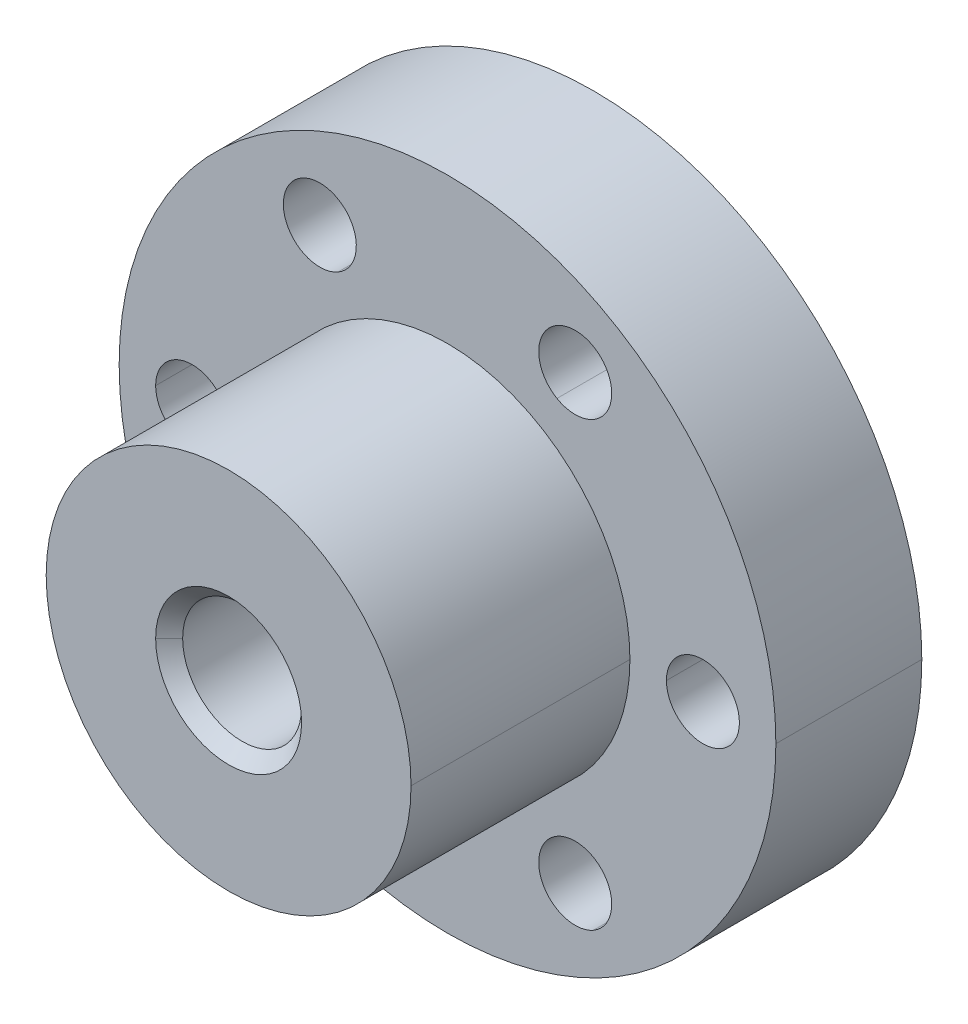
ISO-10303-21;
HEADER;
FILE_DESCRIPTION(('STEP AP214'),'2;1');
FILE_NAME('part.step','',(''),(''),'','','');
FILE_SCHEMA(('AUTOMOTIVE_DESIGN { 1 0 10303 214 1 1 1 1 }'));
ENDSEC;
DATA;
#1=APPLICATION_CONTEXT('core data for automotive mechanical design processes');
#2=APPLICATION_PROTOCOL_DEFINITION('international standard','automotive_design',2000,#1);
#3=PRODUCT_CONTEXT('',#1,'mechanical');
#4=PRODUCT('Part','Part','',(#3));
#5=PRODUCT_RELATED_PRODUCT_CATEGORY('part','',(#4));
#6=PRODUCT_DEFINITION_FORMATION('','',#4);
#7=PRODUCT_DEFINITION_CONTEXT('part definition',#1,'design');
#8=PRODUCT_DEFINITION('design','',#6,#7);
#9=PRODUCT_DEFINITION_SHAPE('','',#8);
#10=(LENGTH_UNIT() NAMED_UNIT(*) SI_UNIT(.MILLI.,.METRE.));
#11=(NAMED_UNIT(*) PLANE_ANGLE_UNIT() SI_UNIT($,.RADIAN.));
#12=(NAMED_UNIT(*) SI_UNIT($,.STERADIAN.) SOLID_ANGLE_UNIT());
#13=UNCERTAINTY_MEASURE_WITH_UNIT(LENGTH_MEASURE(1.E-05),#10,'distance_accuracy_value','');
#14=(GEOMETRIC_REPRESENTATION_CONTEXT(3) GLOBAL_UNCERTAINTY_ASSIGNED_CONTEXT((#13)) GLOBAL_UNIT_ASSIGNED_CONTEXT((#10,
#11,#12)) REPRESENTATION_CONTEXT('',''));
#15=CARTESIAN_POINT('',(0.,0.,0.));
#16=DIRECTION('',(0.,0.,1.));
#17=DIRECTION('',(1.,0.,0.));
#18=AXIS2_PLACEMENT_3D('',#15,#16,#17);
#19=CARTESIAN_POINT('',(0.,0.,0.375));
#20=DIRECTION('',(0.,0.,-1.));
#21=DIRECTION('',(1.,0.,0.));
#22=AXIS2_PLACEMENT_3D('',#19,#20,#21);
#23=CONICAL_SURFACE('',#22,3.625,0.785398163397448);
#24=DIRECTION('',(0.707106781186548,0.,0.707106781186548));
#25=VECTOR('',#24,1.);
#26=CARTESIAN_POINT('',(-3.625,0.,0.375));
#27=LINE('',#26,#25);
#28=CARTESIAN_POINT('',(-4.,0.,0.));
#29=VERTEX_POINT('',#28);
#30=CARTESIAN_POINT('',(-3.26,0.,0.740000000000001));
#31=VERTEX_POINT('',#30);
#32=EDGE_CURVE('E183',#29,#31,#27,.T.);
#33=ORIENTED_EDGE('',*,*,#32,.T.);
#34=CARTESIAN_POINT('',(0.,0.,0.740000000000001));
#35=DIRECTION('',(0.,0.,-1.));
#36=DIRECTION('',(-1.,0.,0.));
#37=AXIS2_PLACEMENT_3D('',#34,#35,#36);
#38=CIRCLE('',#37,3.26);
#39=CARTESIAN_POINT('',(3.26,0.,0.740000000000001));
#40=VERTEX_POINT('',#39);
#41=EDGE_CURVE('E63',#31,#40,#38,.F.);
#42=ORIENTED_EDGE('',*,*,#41,.T.);
#43=DIRECTION('',(0.707106781186548,0.,-0.707106781186548));
#44=VECTOR('',#43,1.);
#45=CARTESIAN_POINT('',(3.625,0.,0.375));
#46=LINE('',#45,#44);
#47=CARTESIAN_POINT('',(4.,0.,0.));
#48=VERTEX_POINT('',#47);
#49=EDGE_CURVE('E181',#40,#48,#46,.T.);
#50=ORIENTED_EDGE('',*,*,#49,.T.);
#51=CARTESIAN_POINT('',(0.,0.,0.));
#52=DIRECTION('',(0.,0.,-1.));
#53=DIRECTION('',(1.,0.,0.));
#54=AXIS2_PLACEMENT_3D('',#51,#52,#53);
#55=CIRCLE('',#54,4.);
#56=EDGE_CURVE('E50',#48,#29,#55,.T.);
#57=ORIENTED_EDGE('',*,*,#56,.T.);
#58=EDGE_LOOP('',(#33,#42,#50,#57));
#59=FACE_BOUND('',#58,.T.);
#60=ADVANCED_FACE('F42',(#59),#23,.F.);
#61=CARTESIAN_POINT('',(11.,0.,0.));
#62=DIRECTION('',(0.,0.,-1.));
#63=DIRECTION('',(0.,-1.,0.));
#64=AXIS2_PLACEMENT_3D('',#61,#62,#63);
#65=PLANE('',#64);
#66=ORIENTED_EDGE('',*,*,#56,.F.);
#67=CARTESIAN_POINT('',(0.,0.,0.));
#68=DIRECTION('',(0.,0.,-1.));
#69=DIRECTION('',(1.,0.,0.));
#70=AXIS2_PLACEMENT_3D('',#67,#68,#69);
#71=CIRCLE('',#70,4.);
#72=EDGE_CURVE('E189',#29,#48,#71,.T.);
#73=ORIENTED_EDGE('',*,*,#72,.F.);
#74=EDGE_LOOP('',(#66,#73));
#75=FACE_BOUND('',#74,.T.);
#76=CARTESIAN_POINT('',(14.,0.,0.));
#77=DIRECTION('',(0.,0.,1.));
#78=DIRECTION('',(1.,0.,0.));
#79=AXIS2_PLACEMENT_3D('',#76,#77,#78);
#80=CIRCLE('',#79,2.);
#81=CARTESIAN_POINT('',(16.,0.,0.));
#82=VERTEX_POINT('',#81);
#83=CARTESIAN_POINT('',(12.,0.,0.));
#84=VERTEX_POINT('',#83);
#85=EDGE_CURVE('E231',#82,#84,#80,.T.);
#86=ORIENTED_EDGE('',*,*,#85,.T.);
#87=CARTESIAN_POINT('',(14.,0.,0.));
#88=DIRECTION('',(0.,0.,1.));
#89=DIRECTION('',(1.,0.,0.));
#90=AXIS2_PLACEMENT_3D('',#87,#88,#89);
#91=CIRCLE('',#90,2.);
#92=EDGE_CURVE('E203',#84,#82,#91,.T.);
#93=ORIENTED_EDGE('',*,*,#92,.T.);
#94=EDGE_LOOP('',(#86,#93));
#95=FACE_BOUND('',#94,.T.);
#96=CARTESIAN_POINT('',(7.,12.1243556529821,0.));
#97=DIRECTION('',(0.,0.,1.));
#98=DIRECTION('',(0.5,0.866025403784439,0.));
#99=AXIS2_PLACEMENT_3D('',#96,#97,#98);
#100=CIRCLE('',#99,2.);
#101=CARTESIAN_POINT('',(8.,13.856406460551,0.));
#102=VERTEX_POINT('',#101);
#103=CARTESIAN_POINT('',(6.,10.3923048454133,0.));
#104=VERTEX_POINT('',#103);
#105=EDGE_CURVE('E237',#102,#104,#100,.T.);
#106=ORIENTED_EDGE('',*,*,#105,.T.);
#107=CARTESIAN_POINT('',(7.,12.1243556529821,0.));
#108=DIRECTION('',(0.,0.,1.));
#109=DIRECTION('',(0.5,0.866025403784439,0.));
#110=AXIS2_PLACEMENT_3D('',#107,#108,#109);
#111=CIRCLE('',#110,2.);
#112=EDGE_CURVE('E215',#104,#102,#111,.T.);
#113=ORIENTED_EDGE('',*,*,#112,.T.);
#114=EDGE_LOOP('',(#106,#113));
#115=FACE_BOUND('',#114,.T.);
#116=CARTESIAN_POINT('',(-7.,12.1243556529821,0.));
#117=DIRECTION('',(0.,0.,1.));
#118=DIRECTION('',(-0.5,0.866025403784439,0.));
#119=AXIS2_PLACEMENT_3D('',#116,#117,#118);
#120=CIRCLE('',#119,2.);
#121=CARTESIAN_POINT('',(-8.,13.856406460551,0.));
#122=VERTEX_POINT('',#121);
#123=CARTESIAN_POINT('',(-6.,10.3923048454133,0.));
#124=VERTEX_POINT('',#123);
#125=EDGE_CURVE('E292',#122,#124,#120,.T.);
#126=ORIENTED_EDGE('',*,*,#125,.T.);
#127=CARTESIAN_POINT('',(-7.,12.1243556529821,0.));
#128=DIRECTION('',(0.,0.,1.));
#129=DIRECTION('',(-0.5,0.866025403784439,0.));
#130=AXIS2_PLACEMENT_3D('',#127,#128,#129);
#131=CIRCLE('',#130,2.);
#132=EDGE_CURVE('E363',#124,#122,#131,.T.);
#133=ORIENTED_EDGE('',*,*,#132,.T.);
#134=EDGE_LOOP('',(#126,#133));
#135=FACE_BOUND('',#134,.T.);
#136=CARTESIAN_POINT('',(-14.,0.,0.));
#137=DIRECTION('',(0.,0.,1.));
#138=DIRECTION('',(-1.,0.,0.));
#139=AXIS2_PLACEMENT_3D('',#136,#137,#138);
#140=CIRCLE('',#139,2.);
#141=CARTESIAN_POINT('',(-16.,0.,0.));
#142=VERTEX_POINT('',#141);
#143=CARTESIAN_POINT('',(-12.,0.,0.));
#144=VERTEX_POINT('',#143);
#145=EDGE_CURVE('E285',#142,#144,#140,.T.);
#146=ORIENTED_EDGE('',*,*,#145,.T.);
#147=CARTESIAN_POINT('',(-14.,0.,0.));
#148=DIRECTION('',(0.,0.,1.));
#149=DIRECTION('',(-1.,0.,0.));
#150=AXIS2_PLACEMENT_3D('',#147,#148,#149);
#151=CIRCLE('',#150,2.);
#152=EDGE_CURVE('E225',#144,#142,#151,.T.);
#153=ORIENTED_EDGE('',*,*,#152,.T.);
#154=EDGE_LOOP('',(#146,#153));
#155=FACE_BOUND('',#154,.T.);
#156=CARTESIAN_POINT('',(-7.,-12.1243556529821,0.));
#157=DIRECTION('',(0.,0.,1.));
#158=DIRECTION('',(-0.5,-0.866025403784439,0.));
#159=AXIS2_PLACEMENT_3D('',#156,#157,#158);
#160=CIRCLE('',#159,2.);
#161=CARTESIAN_POINT('',(-8.,-13.856406460551,0.));
#162=VERTEX_POINT('',#161);
#163=CARTESIAN_POINT('',(-6.,-10.3923048454133,0.));
#164=VERTEX_POINT('',#163);
#165=EDGE_CURVE('E286',#162,#164,#160,.T.);
#166=ORIENTED_EDGE('',*,*,#165,.T.);
#167=CARTESIAN_POINT('',(-7.,-12.1243556529821,0.));
#168=DIRECTION('',(0.,0.,1.));
#169=DIRECTION('',(-0.5,-0.866025403784439,0.));
#170=AXIS2_PLACEMENT_3D('',#167,#168,#169);
#171=CIRCLE('',#170,2.);
#172=EDGE_CURVE('E252',#164,#162,#171,.T.);
#173=ORIENTED_EDGE('',*,*,#172,.T.);
#174=EDGE_LOOP('',(#166,#173));
#175=FACE_BOUND('',#174,.T.);
#176=CARTESIAN_POINT('',(7.,-12.1243556529821,0.));
#177=DIRECTION('',(0.,0.,1.));
#178=DIRECTION('',(0.5,-0.866025403784439,0.));
#179=AXIS2_PLACEMENT_3D('',#176,#177,#178);
#180=CIRCLE('',#179,2.);
#181=CARTESIAN_POINT('',(8.,-13.856406460551,0.));
#182=VERTEX_POINT('',#181);
#183=CARTESIAN_POINT('',(6.,-10.3923048454133,0.));
#184=VERTEX_POINT('',#183);
#185=EDGE_CURVE('E232',#182,#184,#180,.T.);
#186=ORIENTED_EDGE('',*,*,#185,.T.);
#187=CARTESIAN_POINT('',(7.,-12.1243556529821,0.));
#188=DIRECTION('',(0.,0.,1.));
#189=DIRECTION('',(0.5,-0.866025403784439,0.));
#190=AXIS2_PLACEMENT_3D('',#187,#188,#189);
#191=CIRCLE('',#190,2.);
#192=EDGE_CURVE('E301',#184,#182,#191,.T.);
#193=ORIENTED_EDGE('',*,*,#192,.T.);
#194=EDGE_LOOP('',(#186,#193));
#195=FACE_BOUND('',#194,.T.);
#196=CARTESIAN_POINT('',(0.,0.,0.));
#197=DIRECTION('',(0.,0.,-1.));
#198=DIRECTION('',(1.,0.,0.));
#199=AXIS2_PLACEMENT_3D('',#196,#197,#198);
#200=CIRCLE('',#199,18.);
#201=CARTESIAN_POINT('',(18.,0.,0.));
#202=VERTEX_POINT('',#201);
#203=CARTESIAN_POINT('',(-18.,0.,0.));
#204=VERTEX_POINT('',#203);
#205=EDGE_CURVE('E271',#202,#204,#200,.T.);
#206=ORIENTED_EDGE('',*,*,#205,.T.);
#207=CARTESIAN_POINT('',(0.,0.,0.));
#208=DIRECTION('',(0.,0.,-1.));
#209=DIRECTION('',(1.,0.,0.));
#210=AXIS2_PLACEMENT_3D('',#207,#208,#209);
#211=CIRCLE('',#210,18.);
#212=EDGE_CURVE('E342',#204,#202,#211,.T.);
#213=ORIENTED_EDGE('',*,*,#212,.T.);
#214=EDGE_LOOP('',(#206,#213));
#215=FACE_BOUND('',#214,.T.);
#216=ADVANCED_FACE('F44',(#75,#95,#115,#135,#155,#175,#195,#215),#65,.T.);
#217=CARTESIAN_POINT('',(0.,0.,4.));
#218=DIRECTION('',(0.,0.,1.));
#219=DIRECTION('',(1.,0.,0.));
#220=AXIS2_PLACEMENT_3D('',#217,#218,#219);
#221=CYLINDRICAL_SURFACE('',#220,18.);
#222=DIRECTION('',(0.,0.,-1.));
#223=VECTOR('',#222,1.);
#224=CARTESIAN_POINT('',(18.,0.,4.));
#225=LINE('',#224,#223);
#226=CARTESIAN_POINT('',(18.,0.,8.));
#227=VERTEX_POINT('',#226);
#228=EDGE_CURVE('E318',#227,#202,#225,.T.);
#229=ORIENTED_EDGE('',*,*,#228,.T.);
#230=ORIENTED_EDGE('',*,*,#212,.F.);
#231=DIRECTION('',(0.,0.,1.));
#232=VECTOR('',#231,1.);
#233=CARTESIAN_POINT('',(-18.,0.,4.));
#234=LINE('',#233,#232);
#235=CARTESIAN_POINT('',(-18.,0.,8.));
#236=VERTEX_POINT('',#235);
#237=EDGE_CURVE('E307',#204,#236,#234,.T.);
#238=ORIENTED_EDGE('',*,*,#237,.T.);
#239=CARTESIAN_POINT('',(0.,0.,8.));
#240=DIRECTION('',(0.,0.,-1.));
#241=DIRECTION('',(1.,0.,0.));
#242=AXIS2_PLACEMENT_3D('',#239,#240,#241);
#243=CIRCLE('',#242,18.);
#244=EDGE_CURVE('E345',#236,#227,#243,.T.);
#245=ORIENTED_EDGE('',*,*,#244,.T.);
#246=EDGE_LOOP('',(#229,#230,#238,#245));
#247=FACE_BOUND('',#246,.T.);
#248=ADVANCED_FACE('F427',(#247),#221,.T.);
#249=CARTESIAN_POINT('',(14.,0.,8.));
#250=DIRECTION('',(0.,0.,1.));
#251=DIRECTION('',(1.,0.,0.));
#252=AXIS2_PLACEMENT_3D('',#249,#250,#251);
#253=PLANE('',#252);
#254=CARTESIAN_POINT('',(0.,0.,8.));
#255=DIRECTION('',(0.,0.,-1.));
#256=DIRECTION('',(1.,0.,0.));
#257=AXIS2_PLACEMENT_3D('',#254,#255,#256);
#258=CIRCLE('',#257,10.);
#259=CARTESIAN_POINT('',(10.,0.,8.));
#260=VERTEX_POINT('',#259);
#261=CARTESIAN_POINT('',(-10.,0.,8.));
#262=VERTEX_POINT('',#261);
#263=EDGE_CURVE('E242',#260,#262,#258,.T.);
#264=ORIENTED_EDGE('',*,*,#263,.T.);
#265=CARTESIAN_POINT('',(0.,0.,8.));
#266=DIRECTION('',(0.,0.,-1.));
#267=DIRECTION('',(1.,0.,0.));
#268=AXIS2_PLACEMENT_3D('',#265,#266,#267);
#269=CIRCLE('',#268,10.);
#270=EDGE_CURVE('E355',#262,#260,#269,.T.);
#271=ORIENTED_EDGE('',*,*,#270,.T.);
#272=EDGE_LOOP('',(#264,#271));
#273=FACE_BOUND('',#272,.T.);
#274=CARTESIAN_POINT('',(14.,0.,8.));
#275=DIRECTION('',(0.,0.,-1.));
#276=DIRECTION('',(1.,0.,0.));
#277=AXIS2_PLACEMENT_3D('',#274,#275,#276);
#278=CIRCLE('',#277,2.);
#279=CARTESIAN_POINT('',(16.,0.,8.));
#280=VERTEX_POINT('',#279);
#281=CARTESIAN_POINT('',(12.,0.,8.));
#282=VERTEX_POINT('',#281);
#283=EDGE_CURVE('E251',#280,#282,#278,.T.);
#284=ORIENTED_EDGE('',*,*,#283,.T.);
#285=CARTESIAN_POINT('',(14.,0.,8.));
#286=DIRECTION('',(0.,0.,-1.));
#287=DIRECTION('',(1.,0.,0.));
#288=AXIS2_PLACEMENT_3D('',#285,#286,#287);
#289=CIRCLE('',#288,2.);
#290=EDGE_CURVE('E240',#282,#280,#289,.T.);
#291=ORIENTED_EDGE('',*,*,#290,.T.);
#292=EDGE_LOOP('',(#284,#291));
#293=FACE_BOUND('',#292,.T.);
#294=CARTESIAN_POINT('',(7.,12.1243556529821,8.));
#295=DIRECTION('',(0.,0.,-1.));
#296=DIRECTION('',(0.5,0.866025403784439,0.));
#297=AXIS2_PLACEMENT_3D('',#294,#295,#296);
#298=CIRCLE('',#297,2.);
#299=CARTESIAN_POINT('',(8.,13.856406460551,8.));
#300=VERTEX_POINT('',#299);
#301=CARTESIAN_POINT('',(6.,10.3923048454133,8.));
#302=VERTEX_POINT('',#301);
#303=EDGE_CURVE('E209',#300,#302,#298,.T.);
#304=ORIENTED_EDGE('',*,*,#303,.T.);
#305=CARTESIAN_POINT('',(7.,12.1243556529821,8.));
#306=DIRECTION('',(0.,0.,-1.));
#307=DIRECTION('',(0.5,0.866025403784439,0.));
#308=AXIS2_PLACEMENT_3D('',#305,#306,#307);
#309=CIRCLE('',#308,2.);
#310=EDGE_CURVE('E241',#302,#300,#309,.T.);
#311=ORIENTED_EDGE('',*,*,#310,.T.);
#312=EDGE_LOOP('',(#304,#311));
#313=FACE_BOUND('',#312,.T.);
#314=CARTESIAN_POINT('',(-7.,12.1243556529821,8.));
#315=DIRECTION('',(0.,0.,-1.));
#316=DIRECTION('',(-0.5,0.866025403784439,0.));
#317=AXIS2_PLACEMENT_3D('',#314,#315,#316);
#318=CIRCLE('',#317,2.);
#319=CARTESIAN_POINT('',(-8.,13.856406460551,8.));
#320=VERTEX_POINT('',#319);
#321=CARTESIAN_POINT('',(-6.,10.3923048454133,8.));
#322=VERTEX_POINT('',#321);
#323=EDGE_CURVE('E297',#320,#322,#318,.T.);
#324=ORIENTED_EDGE('',*,*,#323,.T.);
#325=CARTESIAN_POINT('',(-7.,12.1243556529821,8.));
#326=DIRECTION('',(0.,0.,-1.));
#327=DIRECTION('',(-0.5,0.866025403784439,0.));
#328=AXIS2_PLACEMENT_3D('',#325,#326,#327);
#329=CIRCLE('',#328,2.);
#330=EDGE_CURVE('E289',#322,#320,#329,.T.);
#331=ORIENTED_EDGE('',*,*,#330,.T.);
#332=EDGE_LOOP('',(#324,#331));
#333=FACE_BOUND('',#332,.T.);
#334=CARTESIAN_POINT('',(-14.,0.,8.));
#335=DIRECTION('',(0.,0.,-1.));
#336=DIRECTION('',(-1.,0.,0.));
#337=AXIS2_PLACEMENT_3D('',#334,#335,#336);
#338=CIRCLE('',#337,2.);
#339=CARTESIAN_POINT('',(-16.,0.,8.));
#340=VERTEX_POINT('',#339);
#341=CARTESIAN_POINT('',(-12.,0.,8.));
#342=VERTEX_POINT('',#341);
#343=EDGE_CURVE('E224',#340,#342,#338,.T.);
#344=ORIENTED_EDGE('',*,*,#343,.T.);
#345=CARTESIAN_POINT('',(-14.,0.,8.));
#346=DIRECTION('',(0.,0.,-1.));
#347=DIRECTION('',(-1.,0.,0.));
#348=AXIS2_PLACEMENT_3D('',#345,#346,#347);
#349=CIRCLE('',#348,2.);
#350=EDGE_CURVE('E282',#342,#340,#349,.T.);
#351=ORIENTED_EDGE('',*,*,#350,.T.);
#352=EDGE_LOOP('',(#344,#351));
#353=FACE_BOUND('',#352,.T.);
#354=CARTESIAN_POINT('',(-7.,-12.1243556529821,8.));
#355=DIRECTION('',(0.,0.,-1.));
#356=DIRECTION('',(-0.5,-0.866025403784439,0.));
#357=AXIS2_PLACEMENT_3D('',#354,#355,#356);
#358=CIRCLE('',#357,2.);
#359=CARTESIAN_POINT('',(-8.,-13.856406460551,8.));
#360=VERTEX_POINT('',#359);
#361=CARTESIAN_POINT('',(-6.,-10.3923048454133,8.));
#362=VERTEX_POINT('',#361);
#363=EDGE_CURVE('E275',#360,#362,#358,.T.);
#364=ORIENTED_EDGE('',*,*,#363,.T.);
#365=CARTESIAN_POINT('',(-7.,-12.1243556529821,8.));
#366=DIRECTION('',(0.,0.,-1.));
#367=DIRECTION('',(-0.5,-0.866025403784439,0.));
#368=AXIS2_PLACEMENT_3D('',#365,#366,#367);
#369=CIRCLE('',#368,2.);
#370=EDGE_CURVE('E235',#362,#360,#369,.T.);
#371=ORIENTED_EDGE('',*,*,#370,.T.);
#372=EDGE_LOOP('',(#364,#371));
#373=FACE_BOUND('',#372,.T.);
#374=CARTESIAN_POINT('',(7.,-12.1243556529821,8.));
#375=DIRECTION('',(0.,0.,-1.));
#376=DIRECTION('',(0.5,-0.866025403784439,0.));
#377=AXIS2_PLACEMENT_3D('',#374,#375,#376);
#378=CIRCLE('',#377,2.);
#379=CARTESIAN_POINT('',(8.,-13.856406460551,8.));
#380=VERTEX_POINT('',#379);
#381=CARTESIAN_POINT('',(6.,-10.3923048454133,8.));
#382=VERTEX_POINT('',#381);
#383=EDGE_CURVE('E261',#380,#382,#378,.T.);
#384=ORIENTED_EDGE('',*,*,#383,.T.);
#385=CARTESIAN_POINT('',(7.,-12.1243556529821,8.));
#386=DIRECTION('',(0.,0.,-1.));
#387=DIRECTION('',(0.5,-0.866025403784439,0.));
#388=AXIS2_PLACEMENT_3D('',#385,#386,#387);
#389=CIRCLE('',#388,2.);
#390=EDGE_CURVE('E236',#382,#380,#389,.T.);
#391=ORIENTED_EDGE('',*,*,#390,.T.);
#392=EDGE_LOOP('',(#384,#391));
#393=FACE_BOUND('',#392,.T.);
#394=CARTESIAN_POINT('',(0.,0.,8.));
#395=DIRECTION('',(0.,0.,-1.));
#396=DIRECTION('',(1.,0.,0.));
#397=AXIS2_PLACEMENT_3D('',#394,#395,#396);
#398=CIRCLE('',#397,18.);
#399=EDGE_CURVE('E201',#227,#236,#398,.T.);
#400=ORIENTED_EDGE('',*,*,#399,.F.);
#401=ORIENTED_EDGE('',*,*,#244,.F.);
#402=EDGE_LOOP('',(#400,#401));
#403=FACE_BOUND('',#402,.T.);
#404=ADVANCED_FACE('F424',(#273,#293,#313,#333,#353,#373,#393,#403),#253,.T.);
#405=CARTESIAN_POINT('',(0.,0.,14.));
#406=DIRECTION('',(0.,0.,1.));
#407=DIRECTION('',(1.,0.,0.));
#408=AXIS2_PLACEMENT_3D('',#405,#406,#407);
#409=CYLINDRICAL_SURFACE('',#408,10.);
#410=DIRECTION('',(0.,0.,-1.));
#411=VECTOR('',#410,1.);
#412=CARTESIAN_POINT('',(10.,0.,14.));
#413=LINE('',#412,#411);
#414=CARTESIAN_POINT('',(10.,0.,20.));
#415=VERTEX_POINT('',#414);
#416=EDGE_CURVE('E266',#415,#260,#413,.T.);
#417=ORIENTED_EDGE('',*,*,#416,.T.);
#418=ORIENTED_EDGE('',*,*,#270,.F.);
#419=DIRECTION('',(0.,0.,1.));
#420=VECTOR('',#419,1.);
#421=CARTESIAN_POINT('',(-10.,0.,14.));
#422=LINE('',#421,#420);
#423=CARTESIAN_POINT('',(-10.,0.,20.));
#424=VERTEX_POINT('',#423);
#425=EDGE_CURVE('E247',#262,#424,#422,.T.);
#426=ORIENTED_EDGE('',*,*,#425,.T.);
#427=CARTESIAN_POINT('',(0.,0.,20.));
#428=DIRECTION('',(0.,0.,-1.));
#429=DIRECTION('',(1.,0.,0.));
#430=AXIS2_PLACEMENT_3D('',#427,#428,#429);
#431=CIRCLE('',#430,10.);
#432=EDGE_CURVE('E230',#424,#415,#431,.T.);
#433=ORIENTED_EDGE('',*,*,#432,.T.);
#434=EDGE_LOOP('',(#417,#418,#426,#433));
#435=FACE_BOUND('',#434,.T.);
#436=ADVANCED_FACE('F414',(#435),#409,.T.);
#437=CARTESIAN_POINT('',(7.,0.,20.));
#438=DIRECTION('',(0.,0.,1.));
#439=DIRECTION('',(1.,0.,0.));
#440=AXIS2_PLACEMENT_3D('',#437,#438,#439);
#441=PLANE('',#440);
#442=CARTESIAN_POINT('',(0.,0.,20.));
#443=DIRECTION('',(0.,0.,-1.));
#444=DIRECTION('',(1.,0.,0.));
#445=AXIS2_PLACEMENT_3D('',#442,#443,#444);
#446=CIRCLE('',#445,4.);
#447=CARTESIAN_POINT('',(4.,0.,20.));
#448=VERTEX_POINT('',#447);
#449=CARTESIAN_POINT('',(-4.,0.,20.));
#450=VERTEX_POINT('',#449);
#451=EDGE_CURVE('E226',#448,#450,#446,.T.);
#452=ORIENTED_EDGE('',*,*,#451,.T.);
#453=CARTESIAN_POINT('',(0.,0.,20.));
#454=DIRECTION('',(0.,0.,-1.));
#455=DIRECTION('',(1.,0.,0.));
#456=AXIS2_PLACEMENT_3D('',#453,#454,#455);
#457=CIRCLE('',#456,4.);
#458=EDGE_CURVE('E334',#450,#448,#457,.T.);
#459=ORIENTED_EDGE('',*,*,#458,.T.);
#460=EDGE_LOOP('',(#452,#459));
#461=FACE_BOUND('',#460,.T.);
#462=CARTESIAN_POINT('',(0.,0.,20.));
#463=DIRECTION('',(0.,0.,-1.));
#464=DIRECTION('',(1.,0.,0.));
#465=AXIS2_PLACEMENT_3D('',#462,#463,#464);
#466=CIRCLE('',#465,10.);
#467=EDGE_CURVE('E270',#415,#424,#466,.T.);
#468=ORIENTED_EDGE('',*,*,#467,.F.);
#469=ORIENTED_EDGE('',*,*,#432,.F.);
#470=EDGE_LOOP('',(#468,#469));
#471=FACE_BOUND('',#470,.T.);
#472=ADVANCED_FACE('F411',(#461,#471),#441,.T.);
#473=CARTESIAN_POINT('',(0.,0.,19.625));
#474=DIRECTION('',(0.,0.,1.));
#475=DIRECTION('',(1.,0.,0.));
#476=AXIS2_PLACEMENT_3D('',#473,#474,#475);
#477=CONICAL_SURFACE('',#476,3.625,0.785398163397448);
#478=DIRECTION('',(-0.707106781186548,0.,-0.707106781186548));
#479=VECTOR('',#478,1.);
#480=CARTESIAN_POINT('',(3.625,0.,19.625));
#481=LINE('',#480,#479);
#482=CARTESIAN_POINT('',(3.26,0.,19.26));
#483=VERTEX_POINT('',#482);
#484=EDGE_CURVE('E246',#448,#483,#481,.T.);
#485=ORIENTED_EDGE('',*,*,#484,.T.);
#486=CARTESIAN_POINT('',(0.,0.,19.26));
#487=DIRECTION('',(0.,0.,1.));
#488=DIRECTION('',(1.,0.,0.));
#489=AXIS2_PLACEMENT_3D('',#486,#487,#488);
#490=CIRCLE('',#489,3.26);
#491=CARTESIAN_POINT('',(-3.26,0.,19.26));
#492=VERTEX_POINT('',#491);
#493=EDGE_CURVE('E56',#483,#492,#490,.F.);
#494=ORIENTED_EDGE('',*,*,#493,.T.);
#495=DIRECTION('',(-0.707106781186548,0.,0.707106781186548));
#496=VECTOR('',#495,1.);
#497=CARTESIAN_POINT('',(-3.625,0.,19.625));
#498=LINE('',#497,#496);
#499=EDGE_CURVE('E305',#492,#450,#498,.T.);
#500=ORIENTED_EDGE('',*,*,#499,.T.);
#501=ORIENTED_EDGE('',*,*,#451,.F.);
#502=EDGE_LOOP('',(#485,#494,#500,#501));
#503=FACE_BOUND('',#502,.T.);
#504=ADVANCED_FACE('F409',(#503),#477,.F.);
#505=CARTESIAN_POINT('',(14.,0.,4.));
#506=DIRECTION('',(0.,0.,1.));
#507=DIRECTION('',(1.,0.,0.));
#508=AXIS2_PLACEMENT_3D('',#505,#506,#507);
#509=CYLINDRICAL_SURFACE('',#508,2.);
#510=DIRECTION('',(0.,0.,1.));
#511=VECTOR('',#510,1.);
#512=CARTESIAN_POINT('',(16.,0.,4.));
#513=LINE('',#512,#511);
#514=EDGE_CURVE('E208',#82,#280,#513,.T.);
#515=ORIENTED_EDGE('',*,*,#514,.T.);
#516=ORIENTED_EDGE('',*,*,#290,.F.);
#517=DIRECTION('',(0.,0.,-1.));
#518=VECTOR('',#517,1.);
#519=CARTESIAN_POINT('',(12.,0.,4.));
#520=LINE('',#519,#518);
#521=EDGE_CURVE('E207',#282,#84,#520,.T.);
#522=ORIENTED_EDGE('',*,*,#521,.T.);
#523=ORIENTED_EDGE('',*,*,#85,.F.);
#524=EDGE_LOOP('',(#515,#516,#522,#523));
#525=FACE_BOUND('',#524,.T.);
#526=ADVANCED_FACE('F469',(#525),#509,.F.);
#527=CARTESIAN_POINT('',(7.,12.1243556529821,4.));
#528=DIRECTION('',(0.,0.,1.));
#529=DIRECTION('',(0.5,0.866025403784439,0.));
#530=AXIS2_PLACEMENT_3D('',#527,#528,#529);
#531=CYLINDRICAL_SURFACE('',#530,2.);
#532=DIRECTION('',(0.,0.,1.));
#533=VECTOR('',#532,1.);
#534=CARTESIAN_POINT('',(8.,13.856406460551,4.));
#535=LINE('',#534,#533);
#536=EDGE_CURVE('E219',#102,#300,#535,.T.);
#537=ORIENTED_EDGE('',*,*,#536,.T.);
#538=ORIENTED_EDGE('',*,*,#310,.F.);
#539=DIRECTION('',(0.,0.,-1.));
#540=VECTOR('',#539,1.);
#541=CARTESIAN_POINT('',(6.,10.3923048454133,4.));
#542=LINE('',#541,#540);
#543=EDGE_CURVE('E214',#302,#104,#542,.T.);
#544=ORIENTED_EDGE('',*,*,#543,.T.);
#545=ORIENTED_EDGE('',*,*,#105,.F.);
#546=EDGE_LOOP('',(#537,#538,#544,#545));
#547=FACE_BOUND('',#546,.T.);
#548=ADVANCED_FACE('F467',(#547),#531,.F.);
#549=CARTESIAN_POINT('',(-7.,12.1243556529821,4.));
#550=DIRECTION('',(0.,0.,1.));
#551=DIRECTION('',(-0.5,0.866025403784439,0.));
#552=AXIS2_PLACEMENT_3D('',#549,#550,#551);
#553=CYLINDRICAL_SURFACE('',#552,2.);
#554=DIRECTION('',(0.,0.,1.));
#555=VECTOR('',#554,1.);
#556=CARTESIAN_POINT('',(-8.,13.856406460551,4.));
#557=LINE('',#556,#555);
#558=EDGE_CURVE('E213',#122,#320,#557,.T.);
#559=ORIENTED_EDGE('',*,*,#558,.T.);
#560=ORIENTED_EDGE('',*,*,#330,.F.);
#561=DIRECTION('',(0.,0.,-1.));
#562=VECTOR('',#561,1.);
#563=CARTESIAN_POINT('',(-6.,10.3923048454133,4.));
#564=LINE('',#563,#562);
#565=EDGE_CURVE('E340',#322,#124,#564,.T.);
#566=ORIENTED_EDGE('',*,*,#565,.T.);
#567=ORIENTED_EDGE('',*,*,#125,.F.);
#568=EDGE_LOOP('',(#559,#560,#566,#567));
#569=FACE_BOUND('',#568,.T.);
#570=ADVANCED_FACE('F463',(#569),#553,.F.);
#571=CARTESIAN_POINT('',(-14.,0.,4.));
#572=DIRECTION('',(0.,0.,1.));
#573=DIRECTION('',(-1.,0.,0.));
#574=AXIS2_PLACEMENT_3D('',#571,#572,#573);
#575=CYLINDRICAL_SURFACE('',#574,2.);
#576=DIRECTION('',(0.,0.,1.));
#577=VECTOR('',#576,1.);
#578=CARTESIAN_POINT('',(-16.,0.,4.));
#579=LINE('',#578,#577);
#580=EDGE_CURVE('E293',#142,#340,#579,.T.);
#581=ORIENTED_EDGE('',*,*,#580,.T.);
#582=ORIENTED_EDGE('',*,*,#350,.F.);
#583=DIRECTION('',(0.,0.,-1.));
#584=VECTOR('',#583,1.);
#585=CARTESIAN_POINT('',(-12.,0.,4.));
#586=LINE('',#585,#584);
#587=EDGE_CURVE('E220',#342,#144,#586,.T.);
#588=ORIENTED_EDGE('',*,*,#587,.T.);
#589=ORIENTED_EDGE('',*,*,#145,.F.);
#590=EDGE_LOOP('',(#581,#582,#588,#589));
#591=FACE_BOUND('',#590,.T.);
#592=ADVANCED_FACE('F466',(#591),#575,.F.);
#593=CARTESIAN_POINT('',(-7.,-12.1243556529821,4.));
#594=DIRECTION('',(0.,0.,1.));
#595=DIRECTION('',(-0.5,-0.866025403784439,0.));
#596=AXIS2_PLACEMENT_3D('',#593,#594,#595);
#597=CYLINDRICAL_SURFACE('',#596,2.);
#598=DIRECTION('',(0.,0.,1.));
#599=VECTOR('',#598,1.);
#600=CARTESIAN_POINT('',(-8.,-13.856406460551,4.));
#601=LINE('',#600,#599);
#602=EDGE_CURVE('E257',#162,#360,#601,.T.);
#603=ORIENTED_EDGE('',*,*,#602,.T.);
#604=ORIENTED_EDGE('',*,*,#370,.F.);
#605=DIRECTION('',(0.,0.,-1.));
#606=VECTOR('',#605,1.);
#607=CARTESIAN_POINT('',(-6.,-10.3923048454133,4.));
#608=LINE('',#607,#606);
#609=EDGE_CURVE('E256',#362,#164,#608,.T.);
#610=ORIENTED_EDGE('',*,*,#609,.T.);
#611=ORIENTED_EDGE('',*,*,#165,.F.);
#612=EDGE_LOOP('',(#603,#604,#610,#611));
#613=FACE_BOUND('',#612,.T.);
#614=ADVANCED_FACE('F520',(#613),#597,.F.);
#615=CARTESIAN_POINT('',(7.,-12.1243556529821,4.));
#616=DIRECTION('',(0.,0.,1.));
#617=DIRECTION('',(0.5,-0.866025403784439,0.));
#618=AXIS2_PLACEMENT_3D('',#615,#616,#617);
#619=CYLINDRICAL_SURFACE('',#618,2.);
#620=DIRECTION('',(0.,0.,1.));
#621=VECTOR('',#620,1.);
#622=CARTESIAN_POINT('',(8.,-13.856406460551,4.));
#623=LINE('',#622,#621);
#624=EDGE_CURVE('E354',#182,#380,#623,.T.);
#625=ORIENTED_EDGE('',*,*,#624,.T.);
#626=ORIENTED_EDGE('',*,*,#390,.F.);
#627=DIRECTION('',(0.,0.,-1.));
#628=VECTOR('',#627,1.);
#629=CARTESIAN_POINT('',(6.,-10.3923048454133,4.));
#630=LINE('',#629,#628);
#631=EDGE_CURVE('E265',#382,#184,#630,.T.);
#632=ORIENTED_EDGE('',*,*,#631,.T.);
#633=ORIENTED_EDGE('',*,*,#185,.F.);
#634=EDGE_LOOP('',(#625,#626,#632,#633));
#635=FACE_BOUND('',#634,.T.);
#636=ADVANCED_FACE('F530',(#635),#619,.F.);
#637=CARTESIAN_POINT('',(7.,-12.1243556529821,4.));
#638=DIRECTION('',(0.,0.,1.));
#639=DIRECTION('',(0.5,-0.866025403784439,0.));
#640=AXIS2_PLACEMENT_3D('',#637,#638,#639);
#641=CYLINDRICAL_SURFACE('',#640,2.);
#642=ORIENTED_EDGE('',*,*,#624,.F.);
#643=ORIENTED_EDGE('',*,*,#192,.F.);
#644=ORIENTED_EDGE('',*,*,#631,.F.);
#645=ORIENTED_EDGE('',*,*,#383,.F.);
#646=EDGE_LOOP('',(#642,#643,#644,#645));
#647=FACE_BOUND('',#646,.T.);
#648=ADVANCED_FACE('F539',(#647),#641,.F.);
#649=CARTESIAN_POINT('',(-7.,-12.1243556529821,4.));
#650=DIRECTION('',(0.,0.,1.));
#651=DIRECTION('',(-0.5,-0.866025403784439,0.));
#652=AXIS2_PLACEMENT_3D('',#649,#650,#651);
#653=CYLINDRICAL_SURFACE('',#652,2.);
#654=ORIENTED_EDGE('',*,*,#602,.F.);
#655=ORIENTED_EDGE('',*,*,#172,.F.);
#656=ORIENTED_EDGE('',*,*,#609,.F.);
#657=ORIENTED_EDGE('',*,*,#363,.F.);
#658=EDGE_LOOP('',(#654,#655,#656,#657));
#659=FACE_BOUND('',#658,.T.);
#660=ADVANCED_FACE('F548',(#659),#653,.F.);
#661=CARTESIAN_POINT('',(-14.,0.,4.));
#662=DIRECTION('',(0.,0.,1.));
#663=DIRECTION('',(-1.,0.,0.));
#664=AXIS2_PLACEMENT_3D('',#661,#662,#663);
#665=CYLINDRICAL_SURFACE('',#664,2.);
#666=ORIENTED_EDGE('',*,*,#580,.F.);
#667=ORIENTED_EDGE('',*,*,#152,.F.);
#668=ORIENTED_EDGE('',*,*,#587,.F.);
#669=ORIENTED_EDGE('',*,*,#343,.F.);
#670=EDGE_LOOP('',(#666,#667,#668,#669));
#671=FACE_BOUND('',#670,.T.);
#672=ADVANCED_FACE('F556',(#671),#665,.F.);
#673=CARTESIAN_POINT('',(-7.,12.1243556529821,4.));
#674=DIRECTION('',(0.,0.,1.));
#675=DIRECTION('',(-0.5,0.866025403784439,0.));
#676=AXIS2_PLACEMENT_3D('',#673,#674,#675);
#677=CYLINDRICAL_SURFACE('',#676,2.);
#678=ORIENTED_EDGE('',*,*,#558,.F.);
#679=ORIENTED_EDGE('',*,*,#132,.F.);
#680=ORIENTED_EDGE('',*,*,#565,.F.);
#681=ORIENTED_EDGE('',*,*,#323,.F.);
#682=EDGE_LOOP('',(#678,#679,#680,#681));
#683=FACE_BOUND('',#682,.T.);
#684=ADVANCED_FACE('F565',(#683),#677,.F.);
#685=CARTESIAN_POINT('',(7.,12.1243556529821,4.));
#686=DIRECTION('',(0.,0.,1.));
#687=DIRECTION('',(0.5,0.866025403784439,0.));
#688=AXIS2_PLACEMENT_3D('',#685,#686,#687);
#689=CYLINDRICAL_SURFACE('',#688,2.);
#690=ORIENTED_EDGE('',*,*,#536,.F.);
#691=ORIENTED_EDGE('',*,*,#112,.F.);
#692=ORIENTED_EDGE('',*,*,#543,.F.);
#693=ORIENTED_EDGE('',*,*,#303,.F.);
#694=EDGE_LOOP('',(#690,#691,#692,#693));
#695=FACE_BOUND('',#694,.T.);
#696=ADVANCED_FACE('F572',(#695),#689,.F.);
#697=CARTESIAN_POINT('',(14.,0.,4.));
#698=DIRECTION('',(0.,0.,1.));
#699=DIRECTION('',(1.,0.,0.));
#700=AXIS2_PLACEMENT_3D('',#697,#698,#699);
#701=CYLINDRICAL_SURFACE('',#700,2.);
#702=ORIENTED_EDGE('',*,*,#514,.F.);
#703=ORIENTED_EDGE('',*,*,#92,.F.);
#704=ORIENTED_EDGE('',*,*,#521,.F.);
#705=ORIENTED_EDGE('',*,*,#283,.F.);
#706=EDGE_LOOP('',(#702,#703,#704,#705));
#707=FACE_BOUND('',#706,.T.);
#708=ADVANCED_FACE('F582',(#707),#701,.F.);
#709=CARTESIAN_POINT('',(0.,0.,19.625));
#710=DIRECTION('',(0.,0.,1.));
#711=DIRECTION('',(1.,0.,0.));
#712=AXIS2_PLACEMENT_3D('',#709,#710,#711);
#713=CONICAL_SURFACE('',#712,3.625,0.785398163397448);
#714=ORIENTED_EDGE('',*,*,#499,.F.);
#715=CARTESIAN_POINT('',(0.,0.,19.26));
#716=DIRECTION('',(0.,0.,1.));
#717=DIRECTION('',(1.,0.,0.));
#718=AXIS2_PLACEMENT_3D('',#715,#716,#717);
#719=CIRCLE('',#718,3.26);
#720=EDGE_CURVE('E184',#492,#483,#719,.F.);
#721=ORIENTED_EDGE('',*,*,#720,.T.);
#722=ORIENTED_EDGE('',*,*,#484,.F.);
#723=ORIENTED_EDGE('',*,*,#458,.F.);
#724=EDGE_LOOP('',(#714,#721,#722,#723));
#725=FACE_BOUND('',#724,.T.);
#726=ADVANCED_FACE('F406',(#725),#713,.F.);
#727=CARTESIAN_POINT('',(0.,0.,14.));
#728=DIRECTION('',(0.,0.,1.));
#729=DIRECTION('',(1.,0.,0.));
#730=AXIS2_PLACEMENT_3D('',#727,#728,#729);
#731=CYLINDRICAL_SURFACE('',#730,10.);
#732=ORIENTED_EDGE('',*,*,#416,.F.);
#733=ORIENTED_EDGE('',*,*,#467,.T.);
#734=ORIENTED_EDGE('',*,*,#425,.F.);
#735=ORIENTED_EDGE('',*,*,#263,.F.);
#736=EDGE_LOOP('',(#732,#733,#734,#735));
#737=FACE_BOUND('',#736,.T.);
#738=ADVANCED_FACE('F421',(#737),#731,.T.);
#739=CARTESIAN_POINT('',(0.,0.,4.));
#740=DIRECTION('',(0.,0.,1.));
#741=DIRECTION('',(1.,0.,0.));
#742=AXIS2_PLACEMENT_3D('',#739,#740,#741);
#743=CYLINDRICAL_SURFACE('',#742,18.);
#744=ORIENTED_EDGE('',*,*,#228,.F.);
#745=ORIENTED_EDGE('',*,*,#399,.T.);
#746=ORIENTED_EDGE('',*,*,#237,.F.);
#747=ORIENTED_EDGE('',*,*,#205,.F.);
#748=EDGE_LOOP('',(#744,#745,#746,#747));
#749=FACE_BOUND('',#748,.T.);
#750=ADVANCED_FACE('F448',(#749),#743,.T.);
#751=CARTESIAN_POINT('',(0.,0.,0.375));
#752=DIRECTION('',(0.,0.,-1.));
#753=DIRECTION('',(1.,0.,0.));
#754=AXIS2_PLACEMENT_3D('',#751,#752,#753);
#755=CONICAL_SURFACE('',#754,3.625,0.785398163397448);
#756=ORIENTED_EDGE('',*,*,#49,.F.);
#757=CARTESIAN_POINT('',(0.,0.,0.740000000000001));
#758=DIRECTION('',(0.,0.,-1.));
#759=DIRECTION('',(-1.,0.,0.));
#760=AXIS2_PLACEMENT_3D('',#757,#758,#759);
#761=CIRCLE('',#760,3.26);
#762=EDGE_CURVE('E11',#40,#31,#761,.F.);
#763=ORIENTED_EDGE('',*,*,#762,.T.);
#764=ORIENTED_EDGE('',*,*,#32,.F.);
#765=ORIENTED_EDGE('',*,*,#72,.T.);
#766=EDGE_LOOP('',(#756,#763,#764,#765));
#767=FACE_BOUND('',#766,.T.);
#768=ADVANCED_FACE('F187',(#767),#755,.F.);
#769=CARTESIAN_POINT('',(0.,0.,20.));
#770=DIRECTION('',(0.,0.,-1.));
#771=DIRECTION('',(-1.,0.,0.));
#772=AXIS2_PLACEMENT_3D('',#769,#770,#771);
#773=CYLINDRICAL_SURFACE('',#772,3.26);
#774=ORIENTED_EDGE('',*,*,#762,.F.);
#775=ORIENTED_EDGE('',*,*,#41,.F.);
#776=EDGE_LOOP('',(#774,#775));
#777=FACE_BOUND('',#776,.T.);
#778=ORIENTED_EDGE('',*,*,#720,.F.);
#779=ORIENTED_EDGE('',*,*,#493,.F.);
#780=EDGE_LOOP('',(#778,#779));
#781=FACE_BOUND('',#780,.T.);
#782=ADVANCED_FACE('F175',(#777,#781),#773,.F.);
#783=CLOSED_SHELL('',(#60,#216,#248,#404,#436,#472,#504,#526,#548,#570,#592,#614,#636,#648,#660,
#672,#684,#696,#708,#726,#738,#750,#768,#782));
#784=MANIFOLD_SOLID_BREP('B2',#783);
#785=ADVANCED_BREP_SHAPE_REPRESENTATION('',(#18,#784),#14);
#786=SHAPE_DEFINITION_REPRESENTATION(#9,#785);
ENDSEC;
END-ISO-10303-21;
